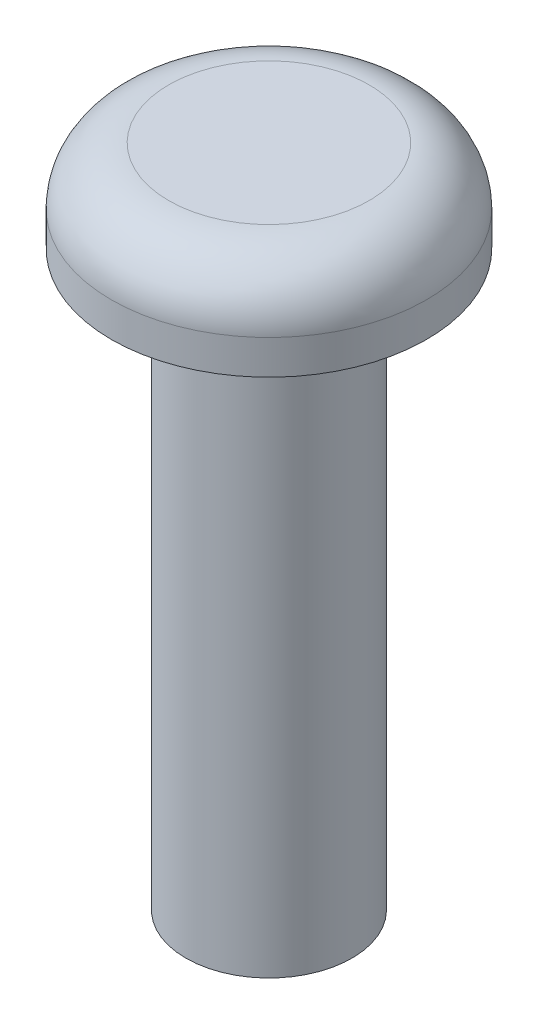
ISO-10303-21;
HEADER;
FILE_DESCRIPTION(('STEP AP214'),'2;1');
FILE_NAME('part.step','',(''),(''),'','','');
FILE_SCHEMA(('AUTOMOTIVE_DESIGN { 1 0 10303 214 1 1 1 1 }'));
ENDSEC;
DATA;
#1=APPLICATION_CONTEXT('core data for automotive mechanical design processes');
#2=APPLICATION_PROTOCOL_DEFINITION('international standard','automotive_design',2000,#1);
#3=PRODUCT_CONTEXT('',#1,'mechanical');
#4=PRODUCT('Part','Part','',(#3));
#5=PRODUCT_RELATED_PRODUCT_CATEGORY('part','',(#4));
#6=PRODUCT_DEFINITION_FORMATION('','',#4);
#7=PRODUCT_DEFINITION_CONTEXT('part definition',#1,'design');
#8=PRODUCT_DEFINITION('design','',#6,#7);
#9=PRODUCT_DEFINITION_SHAPE('','',#8);
#10=(LENGTH_UNIT() NAMED_UNIT(*) SI_UNIT(.MILLI.,.METRE.));
#11=(NAMED_UNIT(*) PLANE_ANGLE_UNIT() SI_UNIT($,.RADIAN.));
#12=(NAMED_UNIT(*) SI_UNIT($,.STERADIAN.) SOLID_ANGLE_UNIT());
#13=UNCERTAINTY_MEASURE_WITH_UNIT(LENGTH_MEASURE(1.E-05),#10,'distance_accuracy_value','');
#14=(GEOMETRIC_REPRESENTATION_CONTEXT(3) GLOBAL_UNCERTAINTY_ASSIGNED_CONTEXT((#13)) GLOBAL_UNIT_ASSIGNED_CONTEXT((#10,
#11,#12)) REPRESENTATION_CONTEXT('',''));
#15=CARTESIAN_POINT('',(0.,0.,0.));
#16=DIRECTION('',(0.,0.,1.));
#17=DIRECTION('',(1.,0.,0.));
#18=AXIS2_PLACEMENT_3D('',#15,#16,#17);
#19=CARTESIAN_POINT('',(0.,-10.,0.));
#20=DIRECTION('',(0.,1.,0.));
#21=DIRECTION('',(0.,0.,1.));
#22=AXIS2_PLACEMENT_3D('',#19,#20,#21);
#23=CYLINDRICAL_SURFACE('',#22,1.45);
#24=CARTESIAN_POINT('',(0.,-10.,0.));
#25=DIRECTION('',(0.,1.,0.));
#26=DIRECTION('',(0.,0.,1.));
#27=AXIS2_PLACEMENT_3D('',#24,#25,#26);
#28=CIRCLE('',#27,1.45);
#29=CARTESIAN_POINT('',(0.,-10.,1.45));
#30=VERTEX_POINT('',#29);
#31=EDGE_CURVE('E41',#30,#30,#28,.T.);
#32=ORIENTED_EDGE('',*,*,#31,.T.);
#33=EDGE_LOOP('',(#32));
#34=FACE_BOUND('',#33,.T.);
#35=CARTESIAN_POINT('',(0.,0.,0.));
#36=DIRECTION('',(0.,1.,0.));
#37=DIRECTION('',(0.,0.,1.));
#38=AXIS2_PLACEMENT_3D('',#35,#36,#37);
#39=CIRCLE('',#38,1.45);
#40=CARTESIAN_POINT('',(0.,0.,1.45));
#41=VERTEX_POINT('',#40);
#42=EDGE_CURVE('E45',#41,#41,#39,.T.);
#43=ORIENTED_EDGE('',*,*,#42,.F.);
#44=EDGE_LOOP('',(#43));
#45=FACE_BOUND('',#44,.T.);
#46=ADVANCED_FACE('F30',(#34,#45),#23,.T.);
#47=CARTESIAN_POINT('',(0.,-10.,0.));
#48=DIRECTION('',(0.,1.,0.));
#49=DIRECTION('',(0.,0.,1.));
#50=AXIS2_PLACEMENT_3D('',#47,#48,#49);
#51=PLANE('',#50);
#52=ORIENTED_EDGE('',*,*,#31,.F.);
#53=EDGE_LOOP('',(#52));
#54=FACE_BOUND('',#53,.T.);
#55=ADVANCED_FACE('F69',(#54),#51,.F.);
#56=CARTESIAN_POINT('',(0.,1.6,0.));
#57=DIRECTION('',(0.,-1.,0.));
#58=DIRECTION('',(0.,0.,-1.));
#59=AXIS2_PLACEMENT_3D('',#56,#57,#58);
#60=CYLINDRICAL_SURFACE('',#59,2.75);
#61=CARTESIAN_POINT('',(0.,0.6,0.));
#62=DIRECTION('',(0.,1.,0.));
#63=DIRECTION('',(0.,0.,1.));
#64=AXIS2_PLACEMENT_3D('',#61,#62,#63);
#65=CIRCLE('',#64,2.75);
#66=CARTESIAN_POINT('',(0.,0.6,2.75));
#67=VERTEX_POINT('',#66);
#68=EDGE_CURVE('E10',#67,#67,#65,.F.);
#69=ORIENTED_EDGE('',*,*,#68,.T.);
#70=EDGE_LOOP('',(#69));
#71=FACE_BOUND('',#70,.T.);
#72=CARTESIAN_POINT('',(0.,0.,0.));
#73=DIRECTION('',(0.,1.,0.));
#74=DIRECTION('',(0.,0.,1.));
#75=AXIS2_PLACEMENT_3D('',#72,#73,#74);
#76=CIRCLE('',#75,2.75);
#77=CARTESIAN_POINT('',(0.,0.,2.75));
#78=VERTEX_POINT('',#77);
#79=EDGE_CURVE('E49',#78,#78,#76,.T.);
#80=ORIENTED_EDGE('',*,*,#79,.T.);
#81=EDGE_LOOP('',(#80));
#82=FACE_BOUND('',#81,.T.);
#83=ADVANCED_FACE('F54',(#71,#82),#60,.T.);
#84=CARTESIAN_POINT('',(0.,1.6,0.));
#85=DIRECTION('',(0.,1.,0.));
#86=DIRECTION('',(0.,0.,1.));
#87=AXIS2_PLACEMENT_3D('',#84,#85,#86);
#88=PLANE('',#87);
#89=CARTESIAN_POINT('',(0.,1.6,0.));
#90=DIRECTION('',(0.,1.,0.));
#91=DIRECTION('',(0.,0.,1.));
#92=AXIS2_PLACEMENT_3D('',#89,#90,#91);
#93=CIRCLE('',#92,1.75);
#94=CARTESIAN_POINT('',(0.,1.6,1.75));
#95=VERTEX_POINT('',#94);
#96=EDGE_CURVE('E37',#95,#95,#93,.T.);
#97=ORIENTED_EDGE('',*,*,#96,.T.);
#98=EDGE_LOOP('',(#97));
#99=FACE_BOUND('',#98,.T.);
#100=ADVANCED_FACE('F58',(#99),#88,.T.);
#101=CARTESIAN_POINT('',(0.,0.,0.));
#102=DIRECTION('',(0.,1.,0.));
#103=DIRECTION('',(0.,0.,1.));
#104=AXIS2_PLACEMENT_3D('',#101,#102,#103);
#105=PLANE('',#104);
#106=ORIENTED_EDGE('',*,*,#42,.T.);
#107=EDGE_LOOP('',(#106));
#108=FACE_BOUND('',#107,.T.);
#109=ORIENTED_EDGE('',*,*,#79,.F.);
#110=EDGE_LOOP('',(#109));
#111=FACE_BOUND('',#110,.T.);
#112=ADVANCED_FACE('F56',(#108,#111),#105,.F.);
#113=CARTESIAN_POINT('',(0.,0.6,0.));
#114=DIRECTION('',(0.,1.,0.));
#115=DIRECTION('',(0.,0.,1.));
#116=AXIS2_PLACEMENT_3D('',#113,#114,#115);
#117=TOROIDAL_SURFACE('',#116,1.75,1.);
#118=ORIENTED_EDGE('',*,*,#68,.F.);
#119=EDGE_LOOP('',(#118));
#120=FACE_BOUND('',#119,.T.);
#121=ORIENTED_EDGE('',*,*,#96,.F.);
#122=EDGE_LOOP('',(#121));
#123=FACE_BOUND('',#122,.T.);
#124=ADVANCED_FACE('F32',(#120,#123),#117,.T.);
#125=CLOSED_SHELL('',(#46,#55,#83,#100,#112,#124));
#126=MANIFOLD_SOLID_BREP('B2',#125);
#127=ADVANCED_BREP_SHAPE_REPRESENTATION('',(#18,#126),#14);
#128=SHAPE_DEFINITION_REPRESENTATION(#9,#127);
ENDSEC;
END-ISO-10303-21;
